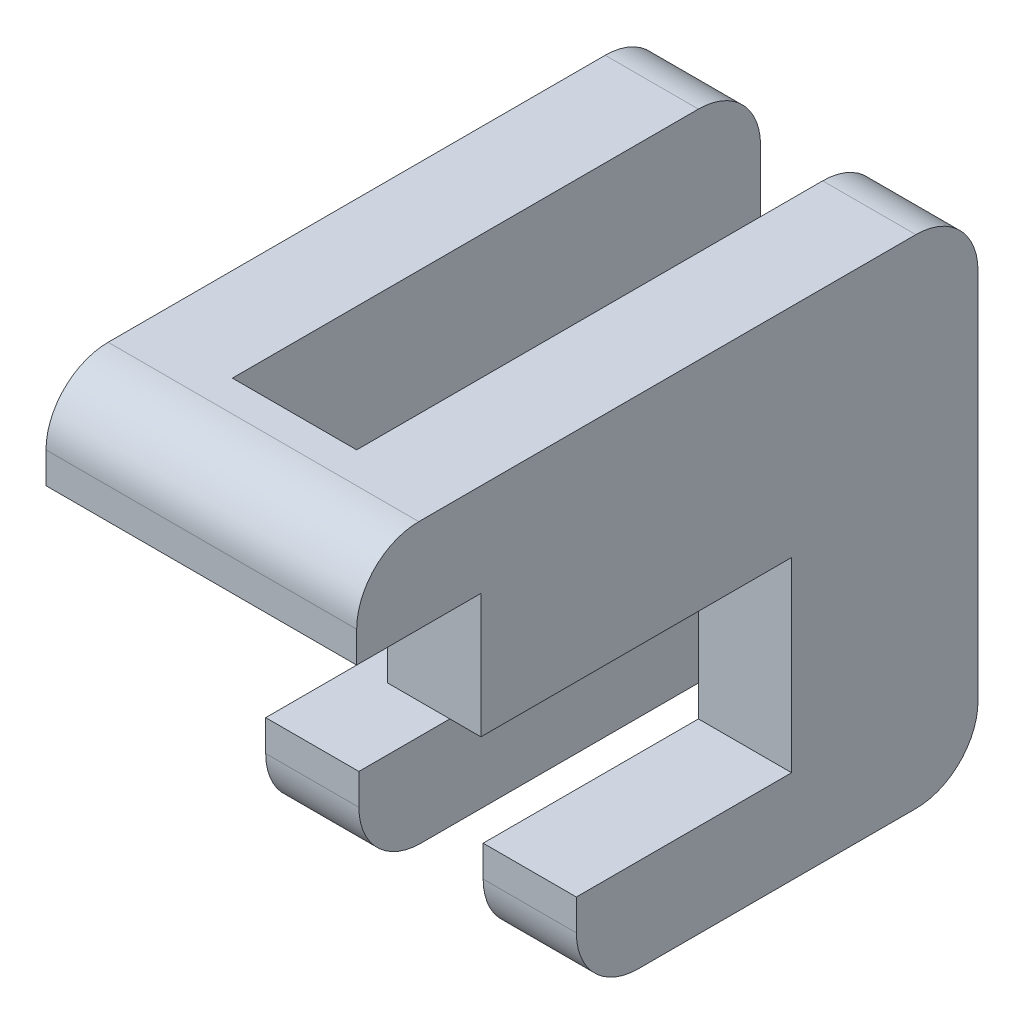
ISO-10303-21;
HEADER;
FILE_DESCRIPTION(('STEP AP214'),'2;1');
FILE_NAME('part.step','',(''),(''),'','','');
FILE_SCHEMA(('AUTOMOTIVE_DESIGN { 1 0 10303 214 1 1 1 1 }'));
ENDSEC;
DATA;
#1=APPLICATION_CONTEXT('core data for automotive mechanical design processes');
#2=APPLICATION_PROTOCOL_DEFINITION('international standard','automotive_design',2000,#1);
#3=PRODUCT_CONTEXT('',#1,'mechanical');
#4=PRODUCT('Part','Part','',(#3));
#5=PRODUCT_RELATED_PRODUCT_CATEGORY('part','',(#4));
#6=PRODUCT_DEFINITION_FORMATION('','',#4);
#7=PRODUCT_DEFINITION_CONTEXT('part definition',#1,'design');
#8=PRODUCT_DEFINITION('design','',#6,#7);
#9=PRODUCT_DEFINITION_SHAPE('','',#8);
#10=(LENGTH_UNIT() NAMED_UNIT(*) SI_UNIT(.MILLI.,.METRE.));
#11=(NAMED_UNIT(*) PLANE_ANGLE_UNIT() SI_UNIT($,.RADIAN.));
#12=(NAMED_UNIT(*) SI_UNIT($,.STERADIAN.) SOLID_ANGLE_UNIT());
#13=UNCERTAINTY_MEASURE_WITH_UNIT(LENGTH_MEASURE(1.E-05),#10,'distance_accuracy_value','');
#14=(GEOMETRIC_REPRESENTATION_CONTEXT(3) GLOBAL_UNCERTAINTY_ASSIGNED_CONTEXT((#13)) GLOBAL_UNIT_ASSIGNED_CONTEXT((#10,
#11,#12)) REPRESENTATION_CONTEXT('',''));
#15=CARTESIAN_POINT('',(0.,0.,0.));
#16=DIRECTION('',(0.,0.,1.));
#17=DIRECTION('',(1.,0.,0.));
#18=AXIS2_PLACEMENT_3D('',#15,#16,#17);
#19=CARTESIAN_POINT('',(10.,-7.,-4.));
#20=DIRECTION('',(0.,0.,-1.));
#21=DIRECTION('',(-1.,0.,0.));
#22=AXIS2_PLACEMENT_3D('',#19,#20,#21);
#23=PLANE('',#22);
#24=DIRECTION('',(-1.,0.,0.));
#25=VECTOR('',#24,1.);
#26=CARTESIAN_POINT('',(10.,-3.,-4.));
#27=LINE('',#26,#25);
#28=CARTESIAN_POINT('',(10.,-3.,-4.));
#29=VERTEX_POINT('',#28);
#30=CARTESIAN_POINT('',(7.,-3.,-4.));
#31=VERTEX_POINT('',#30);
#32=EDGE_CURVE('E246',#29,#31,#27,.T.);
#33=ORIENTED_EDGE('',*,*,#32,.T.);
#34=DIRECTION('',(0.,-1.,0.));
#35=VECTOR('',#34,1.);
#36=CARTESIAN_POINT('',(7.,-7.,-4.));
#37=LINE('',#36,#35);
#38=CARTESIAN_POINT('',(7.,-7.,-4.));
#39=VERTEX_POINT('',#38);
#40=EDGE_CURVE('E375',#31,#39,#37,.T.);
#41=ORIENTED_EDGE('',*,*,#40,.T.);
#42=DIRECTION('',(-1.,0.,0.));
#43=VECTOR('',#42,1.);
#44=CARTESIAN_POINT('',(10.,-7.,-4.));
#45=LINE('',#44,#43);
#46=CARTESIAN_POINT('',(10.,-7.,-4.));
#47=VERTEX_POINT('',#46);
#48=EDGE_CURVE('E300',#47,#39,#45,.T.);
#49=ORIENTED_EDGE('',*,*,#48,.F.);
#50=DIRECTION('',(0.,-1.,0.));
#51=VECTOR('',#50,1.);
#52=CARTESIAN_POINT('',(10.,-7.,-4.));
#53=LINE('',#52,#51);
#54=EDGE_CURVE('E245',#29,#47,#53,.T.);
#55=ORIENTED_EDGE('',*,*,#54,.F.);
#56=EDGE_LOOP('',(#33,#41,#49,#55));
#57=FACE_BOUND('',#56,.T.);
#58=ADVANCED_FACE('F43',(#57),#23,.F.);
#59=CARTESIAN_POINT('',(10.,-7.,-14.));
#60=DIRECTION('',(0.,1.,0.));
#61=DIRECTION('',(0.,0.,1.));
#62=AXIS2_PLACEMENT_3D('',#59,#60,#61);
#63=PLANE('',#62);
#64=ORIENTED_EDGE('',*,*,#48,.T.);
#65=DIRECTION('',(0.,0.,-1.));
#66=VECTOR('',#65,1.);
#67=CARTESIAN_POINT('',(7.,-7.,-14.));
#68=LINE('',#67,#66);
#69=CARTESIAN_POINT('',(7.,-7.,-14.));
#70=VERTEX_POINT('',#69);
#71=EDGE_CURVE('E379',#39,#70,#68,.T.);
#72=ORIENTED_EDGE('',*,*,#71,.T.);
#73=DIRECTION('',(-1.,0.,0.));
#74=VECTOR('',#73,1.);
#75=CARTESIAN_POINT('',(10.,-7.,-14.));
#76=LINE('',#75,#74);
#77=CARTESIAN_POINT('',(10.,-7.,-14.));
#78=VERTEX_POINT('',#77);
#79=EDGE_CURVE('E295',#78,#70,#76,.T.);
#80=ORIENTED_EDGE('',*,*,#79,.F.);
#81=DIRECTION('',(0.,0.,-1.));
#82=VECTOR('',#81,1.);
#83=CARTESIAN_POINT('',(10.,-7.,-14.));
#84=LINE('',#83,#82);
#85=EDGE_CURVE('E129',#47,#78,#84,.T.);
#86=ORIENTED_EDGE('',*,*,#85,.F.);
#87=EDGE_LOOP('',(#64,#72,#80,#86));
#88=FACE_BOUND('',#87,.T.);
#89=ADVANCED_FACE('F454',(#88),#63,.F.);
#90=CARTESIAN_POINT('',(10.,-13.,-14.));
#91=DIRECTION('',(0.,0.,-1.));
#92=DIRECTION('',(-1.,0.,0.));
#93=AXIS2_PLACEMENT_3D('',#90,#91,#92);
#94=PLANE('',#93);
#95=ORIENTED_EDGE('',*,*,#79,.T.);
#96=DIRECTION('',(0.,-1.,0.));
#97=VECTOR('',#96,1.);
#98=CARTESIAN_POINT('',(7.,-13.,-14.));
#99=LINE('',#98,#97);
#100=CARTESIAN_POINT('',(7.,-13.,-14.));
#101=VERTEX_POINT('',#100);
#102=EDGE_CURVE('E383',#70,#101,#99,.T.);
#103=ORIENTED_EDGE('',*,*,#102,.T.);
#104=DIRECTION('',(-1.,0.,0.));
#105=VECTOR('',#104,1.);
#106=CARTESIAN_POINT('',(10.,-13.,-14.));
#107=LINE('',#106,#105);
#108=CARTESIAN_POINT('',(10.,-13.,-14.));
#109=VERTEX_POINT('',#108);
#110=EDGE_CURVE('E290',#109,#101,#107,.T.);
#111=ORIENTED_EDGE('',*,*,#110,.F.);
#112=DIRECTION('',(0.,-1.,0.));
#113=VECTOR('',#112,1.);
#114=CARTESIAN_POINT('',(10.,-13.,-14.));
#115=LINE('',#114,#113);
#116=EDGE_CURVE('E410',#78,#109,#115,.T.);
#117=ORIENTED_EDGE('',*,*,#116,.F.);
#118=EDGE_LOOP('',(#95,#103,#111,#117));
#119=FACE_BOUND('',#118,.T.);
#120=ADVANCED_FACE('F458',(#119),#94,.F.);
#121=CARTESIAN_POINT('',(10.,-13.,-7.07148518940977));
#122=DIRECTION('',(0.,-1.,0.));
#123=DIRECTION('',(0.,0.,-1.));
#124=AXIS2_PLACEMENT_3D('',#121,#122,#123);
#125=PLANE('',#124);
#126=ORIENTED_EDGE('',*,*,#110,.T.);
#127=DIRECTION('',(0.,0.,1.));
#128=VECTOR('',#127,1.);
#129=CARTESIAN_POINT('',(7.,-13.,-7.07148518940977));
#130=LINE('',#129,#128);
#131=CARTESIAN_POINT('',(7.,-13.,-7.07148518940977));
#132=VERTEX_POINT('',#131);
#133=EDGE_CURVE('E387',#101,#132,#130,.T.);
#134=ORIENTED_EDGE('',*,*,#133,.T.);
#135=DIRECTION('',(-1.,0.,0.));
#136=VECTOR('',#135,1.);
#137=CARTESIAN_POINT('',(10.,-13.,-7.07148518940977));
#138=LINE('',#137,#136);
#139=CARTESIAN_POINT('',(10.,-13.,-7.07148518940977));
#140=VERTEX_POINT('',#139);
#141=EDGE_CURVE('E285',#140,#132,#138,.T.);
#142=ORIENTED_EDGE('',*,*,#141,.F.);
#143=DIRECTION('',(0.,0.,1.));
#144=VECTOR('',#143,1.);
#145=CARTESIAN_POINT('',(10.,-13.,-7.07148518940977));
#146=LINE('',#145,#144);
#147=EDGE_CURVE('E413',#109,#140,#146,.T.);
#148=ORIENTED_EDGE('',*,*,#147,.F.);
#149=EDGE_LOOP('',(#126,#134,#142,#148));
#150=FACE_BOUND('',#149,.T.);
#151=ADVANCED_FACE('F464',(#150),#125,.F.);
#152=CARTESIAN_POINT('',(10.,-14.,-7.07148518940977));
#153=DIRECTION('',(0.,0.,-1.));
#154=DIRECTION('',(-1.,0.,0.));
#155=AXIS2_PLACEMENT_3D('',#152,#153,#154);
#156=PLANE('',#155);
#157=ORIENTED_EDGE('',*,*,#141,.T.);
#158=DIRECTION('',(0.,-1.,0.));
#159=VECTOR('',#158,1.);
#160=CARTESIAN_POINT('',(7.,-14.,-7.07148518940977));
#161=LINE('',#160,#159);
#162=CARTESIAN_POINT('',(7.,-14.,-7.07148518940977));
#163=VERTEX_POINT('',#162);
#164=EDGE_CURVE('E391',#132,#163,#161,.T.);
#165=ORIENTED_EDGE('',*,*,#164,.T.);
#166=DIRECTION('',(-1.,0.,0.));
#167=VECTOR('',#166,1.);
#168=CARTESIAN_POINT('',(10.,-14.,-7.07148518940977));
#169=LINE('',#168,#167);
#170=CARTESIAN_POINT('',(10.,-14.,-7.07148518940977));
#171=VERTEX_POINT('',#170);
#172=EDGE_CURVE('E280',#171,#163,#169,.T.);
#173=ORIENTED_EDGE('',*,*,#172,.F.);
#174=DIRECTION('',(0.,-1.,0.));
#175=VECTOR('',#174,1.);
#176=CARTESIAN_POINT('',(10.,-14.,-7.07148518940977));
#177=LINE('',#176,#175);
#178=EDGE_CURVE('E416',#140,#171,#177,.T.);
#179=ORIENTED_EDGE('',*,*,#178,.F.);
#180=EDGE_LOOP('',(#157,#165,#173,#179));
#181=FACE_BOUND('',#180,.T.);
#182=ADVANCED_FACE('F470',(#181),#156,.F.);
#183=CARTESIAN_POINT('',(10.,-14.,-9.07148518940977));
#184=DIRECTION('',(-1.,0.,0.));
#185=DIRECTION('',(0.,0.,1.));
#186=AXIS2_PLACEMENT_3D('',#183,#184,#185);
#187=CYLINDRICAL_SURFACE('',#186,2.);
#188=ORIENTED_EDGE('',*,*,#172,.T.);
#189=CARTESIAN_POINT('',(7.,-14.,-9.07148518940977));
#190=DIRECTION('',(1.,0.,0.));
#191=DIRECTION('',(0.,0.,-1.));
#192=AXIS2_PLACEMENT_3D('',#189,#190,#191);
#193=CIRCLE('',#192,2.);
#194=CARTESIAN_POINT('',(7.,-16.,-9.07148518940979));
#195=VERTEX_POINT('',#194);
#196=EDGE_CURVE('E395',#163,#195,#193,.T.);
#197=ORIENTED_EDGE('',*,*,#196,.T.);
#198=DIRECTION('',(-1.,0.,0.));
#199=VECTOR('',#198,1.);
#200=CARTESIAN_POINT('',(10.,-16.,-9.07148518940979));
#201=LINE('',#200,#199);
#202=CARTESIAN_POINT('',(10.,-16.,-9.07148518940979));
#203=VERTEX_POINT('',#202);
#204=EDGE_CURVE('E275',#203,#195,#201,.T.);
#205=ORIENTED_EDGE('',*,*,#204,.F.);
#206=CARTESIAN_POINT('',(10.,-14.,-9.07148518940977));
#207=DIRECTION('',(1.,0.,0.));
#208=DIRECTION('',(0.,0.,1.));
#209=AXIS2_PLACEMENT_3D('',#206,#207,#208);
#210=CIRCLE('',#209,2.);
#211=EDGE_CURVE('E419',#171,#203,#210,.T.);
#212=ORIENTED_EDGE('',*,*,#211,.F.);
#213=EDGE_LOOP('',(#188,#197,#205,#212));
#214=FACE_BOUND('',#213,.T.);
#215=ADVANCED_FACE('F473',(#214),#187,.T.);
#216=CARTESIAN_POINT('',(10.,-16.,-18.));
#217=DIRECTION('',(0.,1.,0.));
#218=DIRECTION('',(0.,0.,1.));
#219=AXIS2_PLACEMENT_3D('',#216,#217,#218);
#220=PLANE('',#219);
#221=ORIENTED_EDGE('',*,*,#204,.T.);
#222=DIRECTION('',(0.,0.,-1.));
#223=VECTOR('',#222,1.);
#224=CARTESIAN_POINT('',(7.,-16.,-3.));
#225=LINE('',#224,#223);
#226=CARTESIAN_POINT('',(7.,-16.,-18.));
#227=VERTEX_POINT('',#226);
#228=EDGE_CURVE('E344',#195,#227,#225,.T.);
#229=ORIENTED_EDGE('',*,*,#228,.T.);
#230=DIRECTION('',(-1.,0.,0.));
#231=VECTOR('',#230,1.);
#232=CARTESIAN_POINT('',(10.,-16.,-18.));
#233=LINE('',#232,#231);
#234=CARTESIAN_POINT('',(10.,-16.,-18.));
#235=VERTEX_POINT('',#234);
#236=EDGE_CURVE('E270',#235,#227,#233,.T.);
#237=ORIENTED_EDGE('',*,*,#236,.F.);
#238=DIRECTION('',(0.,0.,-1.));
#239=VECTOR('',#238,1.);
#240=CARTESIAN_POINT('',(10.,-16.,-18.));
#241=LINE('',#240,#239);
#242=EDGE_CURVE('E422',#203,#235,#241,.T.);
#243=ORIENTED_EDGE('',*,*,#242,.F.);
#244=EDGE_LOOP('',(#221,#229,#237,#243));
#245=FACE_BOUND('',#244,.T.);
#246=ADVANCED_FACE('F480',(#245),#220,.F.);
#247=CARTESIAN_POINT('',(10.,-14.,-18.));
#248=DIRECTION('',(-1.,0.,0.));
#249=DIRECTION('',(0.,0.,1.));
#250=AXIS2_PLACEMENT_3D('',#247,#248,#249);
#251=CYLINDRICAL_SURFACE('',#250,2.);
#252=ORIENTED_EDGE('',*,*,#236,.T.);
#253=CARTESIAN_POINT('',(7.,-14.,-18.));
#254=DIRECTION('',(1.,0.,0.));
#255=DIRECTION('',(0.,0.,-1.));
#256=AXIS2_PLACEMENT_3D('',#253,#254,#255);
#257=CIRCLE('',#256,2.);
#258=CARTESIAN_POINT('',(7.,-14.,-20.));
#259=VERTEX_POINT('',#258);
#260=EDGE_CURVE('E198',#227,#259,#257,.T.);
#261=ORIENTED_EDGE('',*,*,#260,.T.);
#262=DIRECTION('',(-1.,0.,0.));
#263=VECTOR('',#262,1.);
#264=CARTESIAN_POINT('',(10.,-14.,-20.));
#265=LINE('',#264,#263);
#266=CARTESIAN_POINT('',(10.,-14.,-20.));
#267=VERTEX_POINT('',#266);
#268=EDGE_CURVE('E265',#267,#259,#265,.T.);
#269=ORIENTED_EDGE('',*,*,#268,.F.);
#270=CARTESIAN_POINT('',(10.,-14.,-18.));
#271=DIRECTION('',(1.,0.,0.));
#272=DIRECTION('',(0.,0.,1.));
#273=AXIS2_PLACEMENT_3D('',#270,#271,#272);
#274=CIRCLE('',#273,2.);
#275=EDGE_CURVE('E425',#235,#267,#274,.T.);
#276=ORIENTED_EDGE('',*,*,#275,.F.);
#277=EDGE_LOOP('',(#252,#261,#269,#276));
#278=FACE_BOUND('',#277,.T.);
#279=ADVANCED_FACE('F484',(#278),#251,.T.);
#280=CARTESIAN_POINT('',(10.,-2.00000000000001,-20.));
#281=DIRECTION('',(0.,0.,1.));
#282=DIRECTION('',(1.,0.,0.));
#283=AXIS2_PLACEMENT_3D('',#280,#281,#282);
#284=PLANE('',#283);
#285=ORIENTED_EDGE('',*,*,#268,.T.);
#286=DIRECTION('',(0.,1.,0.));
#287=VECTOR('',#286,1.);
#288=CARTESIAN_POINT('',(7.,-16.,-20.));
#289=LINE('',#288,#287);
#290=CARTESIAN_POINT('',(7.,-2.,-20.));
#291=VERTEX_POINT('',#290);
#292=EDGE_CURVE('E330',#259,#291,#289,.T.);
#293=ORIENTED_EDGE('',*,*,#292,.T.);
#294=DIRECTION('',(-1.,0.,0.));
#295=VECTOR('',#294,1.);
#296=CARTESIAN_POINT('',(10.,-2.00000000000001,-20.));
#297=LINE('',#296,#295);
#298=CARTESIAN_POINT('',(10.,-2.00000000000001,-20.));
#299=VERTEX_POINT('',#298);
#300=EDGE_CURVE('E260',#299,#291,#297,.T.);
#301=ORIENTED_EDGE('',*,*,#300,.F.);
#302=DIRECTION('',(0.,1.,0.));
#303=VECTOR('',#302,1.);
#304=CARTESIAN_POINT('',(10.,-2.00000000000001,-20.));
#305=LINE('',#304,#303);
#306=EDGE_CURVE('E428',#267,#299,#305,.T.);
#307=ORIENTED_EDGE('',*,*,#306,.F.);
#308=EDGE_LOOP('',(#285,#293,#301,#307));
#309=FACE_BOUND('',#308,.T.);
#310=ADVANCED_FACE('F488',(#309),#284,.F.);
#311=CARTESIAN_POINT('',(10.,-2.,-18.));
#312=DIRECTION('',(-1.,0.,0.));
#313=DIRECTION('',(0.,0.,1.));
#314=AXIS2_PLACEMENT_3D('',#311,#312,#313);
#315=CYLINDRICAL_SURFACE('',#314,2.);
#316=ORIENTED_EDGE('',*,*,#300,.T.);
#317=CARTESIAN_POINT('',(7.,-2.,-18.));
#318=DIRECTION('',(1.,0.,0.));
#319=DIRECTION('',(0.,0.,-1.));
#320=AXIS2_PLACEMENT_3D('',#317,#318,#319);
#321=CIRCLE('',#320,2.);
#322=CARTESIAN_POINT('',(7.,0.,-18.));
#323=VERTEX_POINT('',#322);
#324=EDGE_CURVE('E399',#291,#323,#321,.T.);
#325=ORIENTED_EDGE('',*,*,#324,.T.);
#326=DIRECTION('',(-1.,0.,0.));
#327=VECTOR('',#326,1.);
#328=CARTESIAN_POINT('',(10.,0.,-18.));
#329=LINE('',#328,#327);
#330=CARTESIAN_POINT('',(10.,0.,-18.));
#331=VERTEX_POINT('',#330);
#332=EDGE_CURVE('E255',#331,#323,#329,.T.);
#333=ORIENTED_EDGE('',*,*,#332,.F.);
#334=CARTESIAN_POINT('',(10.,-2.,-18.));
#335=DIRECTION('',(1.,0.,0.));
#336=DIRECTION('',(0.,0.,1.));
#337=AXIS2_PLACEMENT_3D('',#334,#335,#336);
#338=CIRCLE('',#337,2.);
#339=EDGE_CURVE('E431',#299,#331,#338,.T.);
#340=ORIENTED_EDGE('',*,*,#339,.F.);
#341=EDGE_LOOP('',(#316,#325,#333,#340));
#342=FACE_BOUND('',#341,.T.);
#343=ADVANCED_FACE('F439',(#342),#315,.T.);
#344=CARTESIAN_POINT('',(3.00000000000001,-7.,-4.));
#345=VERTEX_POINT('',#344);
#346=CARTESIAN_POINT('',(0.,-7.,-4.));
#347=VERTEX_POINT('',#346);
#348=EDGE_CURVE('E299',#345,#347,#45,.T.);
#349=ORIENTED_EDGE('',*,*,#348,.F.);
#350=DIRECTION('',(0.,1.,0.));
#351=VECTOR('',#350,1.);
#352=CARTESIAN_POINT('',(3.00000000000001,-7.,-4.));
#353=LINE('',#352,#351);
#354=CARTESIAN_POINT('',(3.00000000000001,-3.,-4.));
#355=VERTEX_POINT('',#354);
#356=EDGE_CURVE('E335',#345,#355,#353,.T.);
#357=ORIENTED_EDGE('',*,*,#356,.T.);
#358=CARTESIAN_POINT('',(0.,-3.,-4.));
#359=VERTEX_POINT('',#358);
#360=EDGE_CURVE('E120',#355,#359,#27,.T.);
#361=ORIENTED_EDGE('',*,*,#360,.T.);
#362=DIRECTION('',(0.,-1.,0.));
#363=VECTOR('',#362,1.);
#364=CARTESIAN_POINT('',(0.,-7.,-4.));
#365=LINE('',#364,#363);
#366=EDGE_CURVE('E194',#359,#347,#365,.T.);
#367=ORIENTED_EDGE('',*,*,#366,.T.);
#368=EDGE_LOOP('',(#349,#357,#361,#367));
#369=FACE_BOUND('',#368,.T.);
#370=ADVANCED_FACE('F45',(#369),#23,.F.);
#371=CARTESIAN_POINT('',(3.,-7.,-14.));
#372=VERTEX_POINT('',#371);
#373=CARTESIAN_POINT('',(0.,-7.,-14.));
#374=VERTEX_POINT('',#373);
#375=EDGE_CURVE('E294',#372,#374,#76,.T.);
#376=ORIENTED_EDGE('',*,*,#375,.F.);
#377=DIRECTION('',(0.,0.,1.));
#378=VECTOR('',#377,1.);
#379=CARTESIAN_POINT('',(3.,-7.,-14.));
#380=LINE('',#379,#378);
#381=EDGE_CURVE('E347',#372,#345,#380,.T.);
#382=ORIENTED_EDGE('',*,*,#381,.T.);
#383=ORIENTED_EDGE('',*,*,#348,.T.);
#384=DIRECTION('',(0.,0.,-1.));
#385=VECTOR('',#384,1.);
#386=CARTESIAN_POINT('',(0.,-7.,-14.));
#387=LINE('',#386,#385);
#388=EDGE_CURVE('E197',#347,#374,#387,.T.);
#389=ORIENTED_EDGE('',*,*,#388,.T.);
#390=EDGE_LOOP('',(#376,#382,#383,#389));
#391=FACE_BOUND('',#390,.T.);
#392=ADVANCED_FACE('F599',(#391),#63,.F.);
#393=CARTESIAN_POINT('',(3.,-13.,-14.));
#394=VERTEX_POINT('',#393);
#395=CARTESIAN_POINT('',(0.,-13.,-14.));
#396=VERTEX_POINT('',#395);
#397=EDGE_CURVE('E289',#394,#396,#107,.T.);
#398=ORIENTED_EDGE('',*,*,#397,.F.);
#399=DIRECTION('',(0.,1.,0.));
#400=VECTOR('',#399,1.);
#401=CARTESIAN_POINT('',(3.,-13.,-14.));
#402=LINE('',#401,#400);
#403=EDGE_CURVE('E351',#394,#372,#402,.T.);
#404=ORIENTED_EDGE('',*,*,#403,.T.);
#405=ORIENTED_EDGE('',*,*,#375,.T.);
#406=DIRECTION('',(0.,-1.,0.));
#407=VECTOR('',#406,1.);
#408=CARTESIAN_POINT('',(0.,-13.,-14.));
#409=LINE('',#408,#407);
#410=EDGE_CURVE('E202',#374,#396,#409,.T.);
#411=ORIENTED_EDGE('',*,*,#410,.T.);
#412=EDGE_LOOP('',(#398,#404,#405,#411));
#413=FACE_BOUND('',#412,.T.);
#414=ADVANCED_FACE('F595',(#413),#94,.F.);
#415=CARTESIAN_POINT('',(3.,-13.,-7.07148518940977));
#416=VERTEX_POINT('',#415);
#417=CARTESIAN_POINT('',(0.,-13.,-7.07148518940977));
#418=VERTEX_POINT('',#417);
#419=EDGE_CURVE('E284',#416,#418,#138,.T.);
#420=ORIENTED_EDGE('',*,*,#419,.F.);
#421=DIRECTION('',(0.,0.,-1.));
#422=VECTOR('',#421,1.);
#423=CARTESIAN_POINT('',(3.,-13.,-7.07148518940977));
#424=LINE('',#423,#422);
#425=EDGE_CURVE('E355',#416,#394,#424,.T.);
#426=ORIENTED_EDGE('',*,*,#425,.T.);
#427=ORIENTED_EDGE('',*,*,#397,.T.);
#428=DIRECTION('',(0.,0.,1.));
#429=VECTOR('',#428,1.);
#430=CARTESIAN_POINT('',(0.,-13.,-7.07148518940977));
#431=LINE('',#430,#429);
#432=EDGE_CURVE('E206',#396,#418,#431,.T.);
#433=ORIENTED_EDGE('',*,*,#432,.T.);
#434=EDGE_LOOP('',(#420,#426,#427,#433));
#435=FACE_BOUND('',#434,.T.);
#436=ADVANCED_FACE('F591',(#435),#125,.F.);
#437=CARTESIAN_POINT('',(3.,-14.,-7.07148518940977));
#438=VERTEX_POINT('',#437);
#439=CARTESIAN_POINT('',(0.,-14.,-7.07148518940977));
#440=VERTEX_POINT('',#439);
#441=EDGE_CURVE('E279',#438,#440,#169,.T.);
#442=ORIENTED_EDGE('',*,*,#441,.F.);
#443=DIRECTION('',(0.,1.,0.));
#444=VECTOR('',#443,1.);
#445=CARTESIAN_POINT('',(3.,-14.,-7.07148518940977));
#446=LINE('',#445,#444);
#447=EDGE_CURVE('E359',#438,#416,#446,.T.);
#448=ORIENTED_EDGE('',*,*,#447,.T.);
#449=ORIENTED_EDGE('',*,*,#419,.T.);
#450=DIRECTION('',(0.,-1.,0.));
#451=VECTOR('',#450,1.);
#452=CARTESIAN_POINT('',(0.,-14.,-7.07148518940977));
#453=LINE('',#452,#451);
#454=EDGE_CURVE('E210',#418,#440,#453,.T.);
#455=ORIENTED_EDGE('',*,*,#454,.T.);
#456=EDGE_LOOP('',(#442,#448,#449,#455));
#457=FACE_BOUND('',#456,.T.);
#458=ADVANCED_FACE('F560',(#457),#156,.F.);
#459=CARTESIAN_POINT('',(3.,-16.,-9.07148518940979));
#460=VERTEX_POINT('',#459);
#461=CARTESIAN_POINT('',(0.,-16.,-9.07148518940979));
#462=VERTEX_POINT('',#461);
#463=EDGE_CURVE('E274',#460,#462,#201,.T.);
#464=ORIENTED_EDGE('',*,*,#463,.F.);
#465=CARTESIAN_POINT('',(3.,-14.,-9.07148518940977));
#466=DIRECTION('',(-1.,0.,0.));
#467=DIRECTION('',(0.,0.,1.));
#468=AXIS2_PLACEMENT_3D('',#465,#466,#467);
#469=CIRCLE('',#468,2.);
#470=EDGE_CURVE('E363',#460,#438,#469,.T.);
#471=ORIENTED_EDGE('',*,*,#470,.T.);
#472=ORIENTED_EDGE('',*,*,#441,.T.);
#473=CARTESIAN_POINT('',(0.,-14.,-9.07148518940977));
#474=DIRECTION('',(1.,0.,0.));
#475=DIRECTION('',(0.,0.,1.));
#476=AXIS2_PLACEMENT_3D('',#473,#474,#475);
#477=CIRCLE('',#476,2.);
#478=EDGE_CURVE('E214',#440,#462,#477,.T.);
#479=ORIENTED_EDGE('',*,*,#478,.T.);
#480=EDGE_LOOP('',(#464,#471,#472,#479));
#481=FACE_BOUND('',#480,.T.);
#482=ADVANCED_FACE('F559',(#481),#187,.T.);
#483=CARTESIAN_POINT('',(3.,-16.,-18.));
#484=VERTEX_POINT('',#483);
#485=CARTESIAN_POINT('',(0.,-16.,-18.));
#486=VERTEX_POINT('',#485);
#487=EDGE_CURVE('E269',#484,#486,#233,.T.);
#488=ORIENTED_EDGE('',*,*,#487,.F.);
#489=DIRECTION('',(0.,0.,1.));
#490=VECTOR('',#489,1.);
#491=CARTESIAN_POINT('',(3.00000000000001,-16.,-3.));
#492=LINE('',#491,#490);
#493=EDGE_CURVE('E507',#484,#460,#492,.T.);
#494=ORIENTED_EDGE('',*,*,#493,.T.);
#495=ORIENTED_EDGE('',*,*,#463,.T.);
#496=DIRECTION('',(0.,0.,-1.));
#497=VECTOR('',#496,1.);
#498=CARTESIAN_POINT('',(0.,-16.,-18.));
#499=LINE('',#498,#497);
#500=EDGE_CURVE('E218',#462,#486,#499,.T.);
#501=ORIENTED_EDGE('',*,*,#500,.T.);
#502=EDGE_LOOP('',(#488,#494,#495,#501));
#503=FACE_BOUND('',#502,.T.);
#504=ADVANCED_FACE('F586',(#503),#220,.F.);
#505=CARTESIAN_POINT('',(3.,-14.,-20.));
#506=VERTEX_POINT('',#505);
#507=CARTESIAN_POINT('',(0.,-14.,-20.));
#508=VERTEX_POINT('',#507);
#509=EDGE_CURVE('E264',#506,#508,#265,.T.);
#510=ORIENTED_EDGE('',*,*,#509,.F.);
#511=CARTESIAN_POINT('',(3.,-14.,-18.));
#512=DIRECTION('',(-1.,0.,0.));
#513=DIRECTION('',(0.,0.,1.));
#514=AXIS2_PLACEMENT_3D('',#511,#512,#513);
#515=CIRCLE('',#514,2.);
#516=EDGE_CURVE('E371',#506,#484,#515,.T.);
#517=ORIENTED_EDGE('',*,*,#516,.T.);
#518=ORIENTED_EDGE('',*,*,#487,.T.);
#519=CARTESIAN_POINT('',(0.,-14.,-18.));
#520=DIRECTION('',(1.,0.,0.));
#521=DIRECTION('',(0.,0.,1.));
#522=AXIS2_PLACEMENT_3D('',#519,#520,#521);
#523=CIRCLE('',#522,2.);
#524=EDGE_CURVE('E222',#486,#508,#523,.T.);
#525=ORIENTED_EDGE('',*,*,#524,.T.);
#526=EDGE_LOOP('',(#510,#517,#518,#525));
#527=FACE_BOUND('',#526,.T.);
#528=ADVANCED_FACE('F583',(#527),#251,.T.);
#529=CARTESIAN_POINT('',(3.,-2.,-20.));
#530=VERTEX_POINT('',#529);
#531=CARTESIAN_POINT('',(0.,-2.00000000000001,-20.));
#532=VERTEX_POINT('',#531);
#533=EDGE_CURVE('E259',#530,#532,#297,.T.);
#534=ORIENTED_EDGE('',*,*,#533,.F.);
#535=DIRECTION('',(0.,1.,0.));
#536=VECTOR('',#535,1.);
#537=CARTESIAN_POINT('',(3.,-16.,-20.));
#538=LINE('',#537,#536);
#539=EDGE_CURVE('E337',#506,#530,#538,.T.);
#540=ORIENTED_EDGE('',*,*,#539,.F.);
#541=ORIENTED_EDGE('',*,*,#509,.T.);
#542=DIRECTION('',(0.,1.,0.));
#543=VECTOR('',#542,1.);
#544=CARTESIAN_POINT('',(0.,-2.00000000000001,-20.));
#545=LINE('',#544,#543);
#546=EDGE_CURVE('E226',#508,#532,#545,.T.);
#547=ORIENTED_EDGE('',*,*,#546,.T.);
#548=EDGE_LOOP('',(#534,#540,#541,#547));
#549=FACE_BOUND('',#548,.T.);
#550=ADVANCED_FACE('F579',(#549),#284,.F.);
#551=CARTESIAN_POINT('',(3.,0.,-18.));
#552=VERTEX_POINT('',#551);
#553=CARTESIAN_POINT('',(0.,0.,-18.));
#554=VERTEX_POINT('',#553);
#555=EDGE_CURVE('E254',#552,#554,#329,.T.);
#556=ORIENTED_EDGE('',*,*,#555,.F.);
#557=CARTESIAN_POINT('',(3.,-2.,-18.));
#558=DIRECTION('',(-1.,0.,0.));
#559=DIRECTION('',(0.,0.,1.));
#560=AXIS2_PLACEMENT_3D('',#557,#558,#559);
#561=CIRCLE('',#560,2.);
#562=EDGE_CURVE('E367',#552,#530,#561,.T.);
#563=ORIENTED_EDGE('',*,*,#562,.T.);
#564=ORIENTED_EDGE('',*,*,#533,.T.);
#565=CARTESIAN_POINT('',(0.,-2.,-18.));
#566=DIRECTION('',(1.,0.,0.));
#567=DIRECTION('',(0.,0.,1.));
#568=AXIS2_PLACEMENT_3D('',#565,#566,#567);
#569=CIRCLE('',#568,2.);
#570=EDGE_CURVE('E230',#532,#554,#569,.T.);
#571=ORIENTED_EDGE('',*,*,#570,.T.);
#572=EDGE_LOOP('',(#556,#563,#564,#571));
#573=FACE_BOUND('',#572,.T.);
#574=ADVANCED_FACE('F573',(#573),#315,.T.);
#575=CARTESIAN_POINT('',(10.,0.,-2.00000000000001));
#576=DIRECTION('',(0.,-1.,0.));
#577=DIRECTION('',(0.,0.,-1.));
#578=AXIS2_PLACEMENT_3D('',#575,#576,#577);
#579=PLANE('',#578);
#580=ORIENTED_EDGE('',*,*,#332,.T.);
#581=DIRECTION('',(0.,0.,-1.));
#582=VECTOR('',#581,1.);
#583=CARTESIAN_POINT('',(7.,0.,-3.));
#584=LINE('',#583,#582);
#585=CARTESIAN_POINT('',(7.,0.,-3.));
#586=VERTEX_POINT('',#585);
#587=EDGE_CURVE('E511',#586,#323,#584,.T.);
#588=ORIENTED_EDGE('',*,*,#587,.F.);
#589=DIRECTION('',(1.,0.,0.));
#590=VECTOR('',#589,1.);
#591=CARTESIAN_POINT('',(3.00000000000001,0.,-3.));
#592=LINE('',#591,#590);
#593=CARTESIAN_POINT('',(3.00000000000001,0.,-3.));
#594=VERTEX_POINT('',#593);
#595=EDGE_CURVE('E325',#594,#586,#592,.T.);
#596=ORIENTED_EDGE('',*,*,#595,.F.);
#597=DIRECTION('',(0.,0.,1.));
#598=VECTOR('',#597,1.);
#599=CARTESIAN_POINT('',(3.00000000000001,0.,-3.));
#600=LINE('',#599,#598);
#601=EDGE_CURVE('E514',#552,#594,#600,.T.);
#602=ORIENTED_EDGE('',*,*,#601,.F.);
#603=ORIENTED_EDGE('',*,*,#555,.T.);
#604=DIRECTION('',(0.,0.,1.));
#605=VECTOR('',#604,1.);
#606=CARTESIAN_POINT('',(0.,0.,-2.00000000000001));
#607=LINE('',#606,#605);
#608=CARTESIAN_POINT('',(0.,0.,-2.00000000000001));
#609=VERTEX_POINT('',#608);
#610=EDGE_CURVE('E234',#554,#609,#607,.T.);
#611=ORIENTED_EDGE('',*,*,#610,.T.);
#612=DIRECTION('',(-1.,0.,0.));
#613=VECTOR('',#612,1.);
#614=CARTESIAN_POINT('',(10.,0.,-2.00000000000001));
#615=LINE('',#614,#613);
#616=CARTESIAN_POINT('',(10.,0.,-2.00000000000001));
#617=VERTEX_POINT('',#616);
#618=EDGE_CURVE('E183',#617,#609,#615,.T.);
#619=ORIENTED_EDGE('',*,*,#618,.F.);
#620=DIRECTION('',(0.,0.,1.));
#621=VECTOR('',#620,1.);
#622=CARTESIAN_POINT('',(10.,0.,-2.00000000000001));
#623=LINE('',#622,#621);
#624=EDGE_CURVE('E169',#331,#617,#623,.T.);
#625=ORIENTED_EDGE('',*,*,#624,.F.);
#626=EDGE_LOOP('',(#580,#588,#596,#602,#603,#611,#619,#625));
#627=FACE_BOUND('',#626,.T.);
#628=ADVANCED_FACE('F442',(#627),#579,.F.);
#629=CARTESIAN_POINT('',(10.,-2.,-2.));
#630=DIRECTION('',(-1.,0.,0.));
#631=DIRECTION('',(0.,0.,1.));
#632=AXIS2_PLACEMENT_3D('',#629,#630,#631);
#633=CYLINDRICAL_SURFACE('',#632,2.);
#634=CARTESIAN_POINT('',(0.,-2.,-2.));
#635=DIRECTION('',(1.,0.,0.));
#636=DIRECTION('',(0.,0.,-1.));
#637=AXIS2_PLACEMENT_3D('',#634,#635,#636);
#638=CIRCLE('',#637,2.);
#639=CARTESIAN_POINT('',(0.,-2.00000000000001,0.));
#640=VERTEX_POINT('',#639);
#641=EDGE_CURVE('E179',#609,#640,#638,.T.);
#642=ORIENTED_EDGE('',*,*,#641,.T.);
#643=DIRECTION('',(-1.,0.,0.));
#644=VECTOR('',#643,1.);
#645=CARTESIAN_POINT('',(10.,-2.00000000000001,0.));
#646=LINE('',#645,#644);
#647=CARTESIAN_POINT('',(10.,-2.00000000000001,0.));
#648=VERTEX_POINT('',#647);
#649=EDGE_CURVE('E176',#648,#640,#646,.T.);
#650=ORIENTED_EDGE('',*,*,#649,.F.);
#651=CARTESIAN_POINT('',(10.,-2.,-2.));
#652=DIRECTION('',(1.,0.,0.));
#653=DIRECTION('',(0.,0.,-1.));
#654=AXIS2_PLACEMENT_3D('',#651,#652,#653);
#655=CIRCLE('',#654,2.);
#656=EDGE_CURVE('E162',#617,#648,#655,.T.);
#657=ORIENTED_EDGE('',*,*,#656,.F.);
#658=ORIENTED_EDGE('',*,*,#618,.T.);
#659=EDGE_LOOP('',(#642,#650,#657,#658));
#660=FACE_BOUND('',#659,.T.);
#661=ADVANCED_FACE('F177',(#660),#633,.T.);
#662=CARTESIAN_POINT('',(10.,-3.,0.));
#663=DIRECTION('',(0.,0.,-1.));
#664=DIRECTION('',(-1.,0.,0.));
#665=AXIS2_PLACEMENT_3D('',#662,#663,#664);
#666=PLANE('',#665);
#667=DIRECTION('',(0.,-1.,0.));
#668=VECTOR('',#667,1.);
#669=CARTESIAN_POINT('',(0.,-3.,0.));
#670=LINE('',#669,#668);
#671=CARTESIAN_POINT('',(0.,-3.,0.));
#672=VERTEX_POINT('',#671);
#673=EDGE_CURVE('E239',#640,#672,#670,.T.);
#674=ORIENTED_EDGE('',*,*,#673,.T.);
#675=DIRECTION('',(-1.,0.,0.));
#676=VECTOR('',#675,1.);
#677=CARTESIAN_POINT('',(10.,-3.,0.));
#678=LINE('',#677,#676);
#679=CARTESIAN_POINT('',(10.,-3.,0.));
#680=VERTEX_POINT('',#679);
#681=EDGE_CURVE('E184',#680,#672,#678,.T.);
#682=ORIENTED_EDGE('',*,*,#681,.F.);
#683=DIRECTION('',(0.,-1.,0.));
#684=VECTOR('',#683,1.);
#685=CARTESIAN_POINT('',(10.,-3.,0.));
#686=LINE('',#685,#684);
#687=EDGE_CURVE('E166',#648,#680,#686,.T.);
#688=ORIENTED_EDGE('',*,*,#687,.F.);
#689=ORIENTED_EDGE('',*,*,#649,.T.);
#690=EDGE_LOOP('',(#674,#682,#688,#689));
#691=FACE_BOUND('',#690,.T.);
#692=ADVANCED_FACE('F186',(#691),#666,.F.);
#693=CARTESIAN_POINT('',(10.,-3.,-4.));
#694=DIRECTION('',(0.,1.,0.));
#695=DIRECTION('',(0.,0.,1.));
#696=AXIS2_PLACEMENT_3D('',#693,#694,#695);
#697=PLANE('',#696);
#698=DIRECTION('',(1.,0.,0.));
#699=VECTOR('',#698,1.);
#700=CARTESIAN_POINT('',(10.,-3.,-3.));
#701=LINE('',#700,#699);
#702=CARTESIAN_POINT('',(3.00000000000001,-3.,-3.));
#703=VERTEX_POINT('',#702);
#704=CARTESIAN_POINT('',(7.,-3.,-3.));
#705=VERTEX_POINT('',#704);
#706=EDGE_CURVE('E52',#703,#705,#701,.T.);
#707=ORIENTED_EDGE('',*,*,#706,.T.);
#708=DIRECTION('',(0.,0.,-1.));
#709=VECTOR('',#708,1.);
#710=CARTESIAN_POINT('',(7.,-3.,-4.));
#711=LINE('',#710,#709);
#712=EDGE_CURVE('E11',#705,#31,#711,.T.);
#713=ORIENTED_EDGE('',*,*,#712,.T.);
#714=ORIENTED_EDGE('',*,*,#32,.F.);
#715=DIRECTION('',(0.,0.,-1.));
#716=VECTOR('',#715,1.);
#717=CARTESIAN_POINT('',(10.,-3.,-4.));
#718=LINE('',#717,#716);
#719=EDGE_CURVE('E68',#680,#29,#718,.T.);
#720=ORIENTED_EDGE('',*,*,#719,.F.);
#721=ORIENTED_EDGE('',*,*,#681,.T.);
#722=DIRECTION('',(0.,0.,-1.));
#723=VECTOR('',#722,1.);
#724=CARTESIAN_POINT('',(0.,-3.,-4.));
#725=LINE('',#724,#723);
#726=EDGE_CURVE('E242',#672,#359,#725,.T.);
#727=ORIENTED_EDGE('',*,*,#726,.T.);
#728=ORIENTED_EDGE('',*,*,#360,.F.);
#729=DIRECTION('',(0.,0.,1.));
#730=VECTOR('',#729,1.);
#731=CARTESIAN_POINT('',(3.00000000000001,-3.,-4.));
#732=LINE('',#731,#730);
#733=EDGE_CURVE('E303',#355,#703,#732,.T.);
#734=ORIENTED_EDGE('',*,*,#733,.T.);
#735=EDGE_LOOP('',(#707,#713,#714,#720,#721,#727,#728,#734));
#736=FACE_BOUND('',#735,.T.);
#737=ADVANCED_FACE('F310',(#736),#697,.F.);
#738=CARTESIAN_POINT('',(10.,-2.,-2.));
#739=DIRECTION('',(1.,0.,0.));
#740=DIRECTION('',(0.,0.,-1.));
#741=AXIS2_PLACEMENT_3D('',#738,#739,#740);
#742=PLANE('',#741);
#743=ORIENTED_EDGE('',*,*,#54,.T.);
#744=ORIENTED_EDGE('',*,*,#85,.T.);
#745=ORIENTED_EDGE('',*,*,#116,.T.);
#746=ORIENTED_EDGE('',*,*,#147,.T.);
#747=ORIENTED_EDGE('',*,*,#178,.T.);
#748=ORIENTED_EDGE('',*,*,#211,.T.);
#749=ORIENTED_EDGE('',*,*,#242,.T.);
#750=ORIENTED_EDGE('',*,*,#275,.T.);
#751=ORIENTED_EDGE('',*,*,#306,.T.);
#752=ORIENTED_EDGE('',*,*,#339,.T.);
#753=ORIENTED_EDGE('',*,*,#624,.T.);
#754=ORIENTED_EDGE('',*,*,#656,.T.);
#755=ORIENTED_EDGE('',*,*,#687,.T.);
#756=ORIENTED_EDGE('',*,*,#719,.T.);
#757=EDGE_LOOP('',(#743,#744,#745,#746,#747,#748,#749,#750,#751,#752,#753,#754,#755,#756));
#758=FACE_BOUND('',#757,.T.);
#759=ADVANCED_FACE('F164',(#758),#742,.T.);
#760=CARTESIAN_POINT('',(0.,-2.,-2.));
#761=DIRECTION('',(1.,0.,0.));
#762=DIRECTION('',(0.,0.,-1.));
#763=AXIS2_PLACEMENT_3D('',#760,#761,#762);
#764=PLANE('',#763);
#765=ORIENTED_EDGE('',*,*,#366,.F.);
#766=ORIENTED_EDGE('',*,*,#726,.F.);
#767=ORIENTED_EDGE('',*,*,#673,.F.);
#768=ORIENTED_EDGE('',*,*,#641,.F.);
#769=ORIENTED_EDGE('',*,*,#610,.F.);
#770=ORIENTED_EDGE('',*,*,#570,.F.);
#771=ORIENTED_EDGE('',*,*,#546,.F.);
#772=ORIENTED_EDGE('',*,*,#524,.F.);
#773=ORIENTED_EDGE('',*,*,#500,.F.);
#774=ORIENTED_EDGE('',*,*,#478,.F.);
#775=ORIENTED_EDGE('',*,*,#454,.F.);
#776=ORIENTED_EDGE('',*,*,#432,.F.);
#777=ORIENTED_EDGE('',*,*,#410,.F.);
#778=ORIENTED_EDGE('',*,*,#388,.F.);
#779=EDGE_LOOP('',(#765,#766,#767,#768,#769,#770,#771,#772,#773,#774,#775,#776,#777,#778));
#780=FACE_BOUND('',#779,.T.);
#781=ADVANCED_FACE('F446',(#780),#764,.F.);
#782=CARTESIAN_POINT('',(7.,-16.,-3.));
#783=DIRECTION('',(1.,0.,0.));
#784=DIRECTION('',(0.,0.,-1.));
#785=AXIS2_PLACEMENT_3D('',#782,#783,#784);
#786=PLANE('',#785);
#787=ORIENTED_EDGE('',*,*,#228,.F.);
#788=ORIENTED_EDGE('',*,*,#196,.F.);
#789=ORIENTED_EDGE('',*,*,#164,.F.);
#790=ORIENTED_EDGE('',*,*,#133,.F.);
#791=ORIENTED_EDGE('',*,*,#102,.F.);
#792=ORIENTED_EDGE('',*,*,#71,.F.);
#793=ORIENTED_EDGE('',*,*,#40,.F.);
#794=ORIENTED_EDGE('',*,*,#712,.F.);
#795=DIRECTION('',(0.,1.,0.));
#796=VECTOR('',#795,1.);
#797=CARTESIAN_POINT('',(7.,-16.,-3.));
#798=LINE('',#797,#796);
#799=EDGE_CURVE('E322',#705,#586,#798,.T.);
#800=ORIENTED_EDGE('',*,*,#799,.T.);
#801=ORIENTED_EDGE('',*,*,#587,.T.);
#802=ORIENTED_EDGE('',*,*,#324,.F.);
#803=ORIENTED_EDGE('',*,*,#292,.F.);
#804=ORIENTED_EDGE('',*,*,#260,.F.);
#805=EDGE_LOOP('',(#787,#788,#789,#790,#791,#792,#793,#794,#800,#801,#802,#803,#804));
#806=FACE_BOUND('',#805,.T.);
#807=ADVANCED_FACE('F504',(#806),#786,.F.);
#808=CARTESIAN_POINT('',(3.00000000000001,-16.,-3.));
#809=DIRECTION('',(0.,0.,1.));
#810=DIRECTION('',(1.,0.,0.));
#811=AXIS2_PLACEMENT_3D('',#808,#809,#810);
#812=PLANE('',#811);
#813=DIRECTION('',(0.,1.,0.));
#814=VECTOR('',#813,1.);
#815=CARTESIAN_POINT('',(3.00000000000001,-16.,-3.));
#816=LINE('',#815,#814);
#817=EDGE_CURVE('E59',#703,#594,#816,.T.);
#818=ORIENTED_EDGE('',*,*,#817,.T.);
#819=ORIENTED_EDGE('',*,*,#595,.T.);
#820=ORIENTED_EDGE('',*,*,#799,.F.);
#821=ORIENTED_EDGE('',*,*,#706,.F.);
#822=EDGE_LOOP('',(#818,#819,#820,#821));
#823=FACE_BOUND('',#822,.T.);
#824=ADVANCED_FACE('F318',(#823),#812,.F.);
#825=CARTESIAN_POINT('',(3.00000000000001,-16.,-3.));
#826=DIRECTION('',(-1.,0.,0.));
#827=DIRECTION('',(0.,0.,1.));
#828=AXIS2_PLACEMENT_3D('',#825,#826,#827);
#829=PLANE('',#828);
#830=ORIENTED_EDGE('',*,*,#539,.T.);
#831=ORIENTED_EDGE('',*,*,#562,.F.);
#832=ORIENTED_EDGE('',*,*,#601,.T.);
#833=ORIENTED_EDGE('',*,*,#817,.F.);
#834=ORIENTED_EDGE('',*,*,#733,.F.);
#835=ORIENTED_EDGE('',*,*,#356,.F.);
#836=ORIENTED_EDGE('',*,*,#381,.F.);
#837=ORIENTED_EDGE('',*,*,#403,.F.);
#838=ORIENTED_EDGE('',*,*,#425,.F.);
#839=ORIENTED_EDGE('',*,*,#447,.F.);
#840=ORIENTED_EDGE('',*,*,#470,.F.);
#841=ORIENTED_EDGE('',*,*,#493,.F.);
#842=ORIENTED_EDGE('',*,*,#516,.F.);
#843=EDGE_LOOP('',(#830,#831,#832,#833,#834,#835,#836,#837,#838,#839,#840,#841,#842));
#844=FACE_BOUND('',#843,.T.);
#845=ADVANCED_FACE('F553',(#844),#829,.F.);
#846=CLOSED_SHELL('',(#58,#89,#120,#151,#182,#215,#246,#279,#310,#343,#370,#392,#414,#436,#458,
#482,#504,#528,#550,#574,#628,#661,#692,#737,#759,#781,#807,#824,#845));
#847=MANIFOLD_SOLID_BREP('B2',#846);
#848=ADVANCED_BREP_SHAPE_REPRESENTATION('',(#18,#847),#14);
#849=SHAPE_DEFINITION_REPRESENTATION(#9,#848);
ENDSEC;
END-ISO-10303-21;
